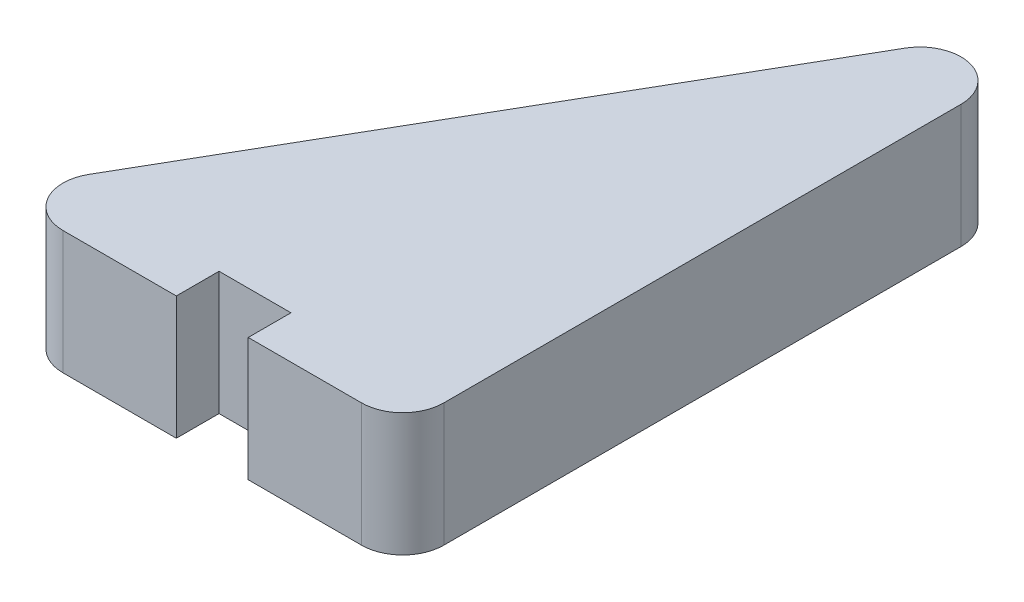
ISO-10303-21;
HEADER;
FILE_DESCRIPTION(('STEP AP214'),'2;1');
FILE_NAME('part.step','',(''),(''),'','','');
FILE_SCHEMA(('AUTOMOTIVE_DESIGN { 1 0 10303 214 1 1 1 1 }'));
ENDSEC;
DATA;
#1=APPLICATION_CONTEXT('core data for automotive mechanical design processes');
#2=APPLICATION_PROTOCOL_DEFINITION('international standard','automotive_design',2000,#1);
#3=PRODUCT_CONTEXT('',#1,'mechanical');
#4=PRODUCT('Part','Part','',(#3));
#5=PRODUCT_RELATED_PRODUCT_CATEGORY('part','',(#4));
#6=PRODUCT_DEFINITION_FORMATION('','',#4);
#7=PRODUCT_DEFINITION_CONTEXT('part definition',#1,'design');
#8=PRODUCT_DEFINITION('design','',#6,#7);
#9=PRODUCT_DEFINITION_SHAPE('','',#8);
#10=(LENGTH_UNIT() NAMED_UNIT(*) SI_UNIT(.MILLI.,.METRE.));
#11=(NAMED_UNIT(*) PLANE_ANGLE_UNIT() SI_UNIT($,.RADIAN.));
#12=(NAMED_UNIT(*) SI_UNIT($,.STERADIAN.) SOLID_ANGLE_UNIT());
#13=UNCERTAINTY_MEASURE_WITH_UNIT(LENGTH_MEASURE(1.E-05),#10,'distance_accuracy_value','');
#14=(GEOMETRIC_REPRESENTATION_CONTEXT(3) GLOBAL_UNCERTAINTY_ASSIGNED_CONTEXT((#13)) GLOBAL_UNIT_ASSIGNED_CONTEXT((#10,
#11,#12)) REPRESENTATION_CONTEXT('',''));
#15=CARTESIAN_POINT('',(0.,0.,0.));
#16=DIRECTION('',(0.,0.,1.));
#17=DIRECTION('',(1.,0.,0.));
#18=AXIS2_PLACEMENT_3D('',#15,#16,#17);
#19=CARTESIAN_POINT('',(-52.5014773719376,19.05,0.));
#20=DIRECTION('',(0.,0.,-1.));
#21=DIRECTION('',(-1.,0.,0.));
#22=AXIS2_PLACEMENT_3D('',#19,#20,#21);
#23=PLANE('',#22);
#24=DIRECTION('',(1.,0.,0.));
#25=VECTOR('',#24,1.);
#26=CARTESIAN_POINT('',(-52.5014773719376,0.,0.));
#27=LINE('',#26,#25);
#28=CARTESIAN_POINT('',(-52.5014773719376,0.,0.));
#29=VERTEX_POINT('',#28);
#30=CARTESIAN_POINT('',(-34.9819886859688,0.,0.));
#31=VERTEX_POINT('',#30);
#32=EDGE_CURVE('E136',#29,#31,#27,.T.);
#33=ORIENTED_EDGE('',*,*,#32,.T.);
#34=DIRECTION('',(0.,1.,0.));
#35=VECTOR('',#34,1.);
#36=CARTESIAN_POINT('',(-34.9819886859688,0.,0.));
#37=LINE('',#36,#35);
#38=CARTESIAN_POINT('',(-34.9819886859688,19.05,0.));
#39=VERTEX_POINT('',#38);
#40=EDGE_CURVE('E169',#31,#39,#37,.T.);
#41=ORIENTED_EDGE('',*,*,#40,.T.);
#42=DIRECTION('',(1.,0.,0.));
#43=VECTOR('',#42,1.);
#44=CARTESIAN_POINT('',(-52.5014773719376,19.05,0.));
#45=LINE('',#44,#43);
#46=CARTESIAN_POINT('',(-52.5014773719376,19.05,0.));
#47=VERTEX_POINT('',#46);
#48=EDGE_CURVE('E91',#47,#39,#45,.T.);
#49=ORIENTED_EDGE('',*,*,#48,.F.);
#50=DIRECTION('',(0.,-1.,0.));
#51=VECTOR('',#50,1.);
#52=CARTESIAN_POINT('',(-52.5014773719376,19.05,0.));
#53=LINE('',#52,#51);
#54=EDGE_CURVE('E11',#47,#29,#53,.T.);
#55=ORIENTED_EDGE('',*,*,#54,.T.);
#56=EDGE_LOOP('',(#33,#41,#49,#55));
#57=FACE_BOUND('',#56,.T.);
#58=ADVANCED_FACE('F32',(#57),#23,.F.);
#59=CARTESIAN_POINT('',(-52.5014773719376,19.05,-6.34999999999999));
#60=DIRECTION('',(0.,-1.,0.));
#61=DIRECTION('',(0.,0.,-1.));
#62=AXIS2_PLACEMENT_3D('',#59,#60,#61);
#63=CYLINDRICAL_SURFACE('',#62,6.35);
#64=CARTESIAN_POINT('',(-52.5014773719376,0.,-6.34999999999999));
#65=DIRECTION('',(0.,1.,0.));
#66=DIRECTION('',(0.,0.,1.));
#67=AXIS2_PLACEMENT_3D('',#64,#65,#66);
#68=CIRCLE('',#67,6.35);
#69=CARTESIAN_POINT('',(-58.0007386859687,0.,-9.52500000000002));
#70=VERTEX_POINT('',#69);
#71=EDGE_CURVE('E131',#70,#29,#68,.T.);
#72=ORIENTED_EDGE('',*,*,#71,.T.);
#73=ORIENTED_EDGE('',*,*,#54,.F.);
#74=CARTESIAN_POINT('',(-52.5014773719376,19.05,-6.34999999999999));
#75=DIRECTION('',(0.,1.,0.));
#76=DIRECTION('',(0.,0.,1.));
#77=AXIS2_PLACEMENT_3D('',#74,#75,#76);
#78=CIRCLE('',#77,6.35);
#79=CARTESIAN_POINT('',(-58.0007386859687,19.05,-9.52500000000002));
#80=VERTEX_POINT('',#79);
#81=EDGE_CURVE('E145',#80,#47,#78,.T.);
#82=ORIENTED_EDGE('',*,*,#81,.F.);
#83=DIRECTION('',(0.,-1.,0.));
#84=VECTOR('',#83,1.);
#85=CARTESIAN_POINT('',(-58.0007386859687,19.05,-9.52500000000002));
#86=LINE('',#85,#84);
#87=EDGE_CURVE('E127',#80,#70,#86,.T.);
#88=ORIENTED_EDGE('',*,*,#87,.T.);
#89=EDGE_LOOP('',(#72,#73,#82,#88));
#90=FACE_BOUND('',#89,.T.);
#91=ADVANCED_FACE('F34',(#90),#63,.T.);
#92=CARTESIAN_POINT('',(-23.8694886859688,19.05,0.));
#93=VERTEX_POINT('',#92);
#94=CARTESIAN_POINT('',(-6.35000000000004,19.05,0.));
#95=VERTEX_POINT('',#94);
#96=EDGE_CURVE('E165',#93,#95,#45,.T.);
#97=ORIENTED_EDGE('',*,*,#96,.F.);
#98=DIRECTION('',(0.,1.,0.));
#99=VECTOR('',#98,1.);
#100=CARTESIAN_POINT('',(-23.8694886859688,0.,0.));
#101=LINE('',#100,#99);
#102=CARTESIAN_POINT('',(-23.8694886859688,0.,0.));
#103=VERTEX_POINT('',#102);
#104=EDGE_CURVE('E203',#103,#93,#101,.T.);
#105=ORIENTED_EDGE('',*,*,#104,.F.);
#106=CARTESIAN_POINT('',(-6.35000000000004,0.,0.));
#107=VERTEX_POINT('',#106);
#108=EDGE_CURVE('E134',#103,#107,#27,.T.);
#109=ORIENTED_EDGE('',*,*,#108,.T.);
#110=DIRECTION('',(0.,-1.,0.));
#111=VECTOR('',#110,1.);
#112=CARTESIAN_POINT('',(-6.35000000000004,19.05,0.));
#113=LINE('',#112,#111);
#114=EDGE_CURVE('E40',#95,#107,#113,.T.);
#115=ORIENTED_EDGE('',*,*,#114,.F.);
#116=EDGE_LOOP('',(#97,#105,#109,#115));
#117=FACE_BOUND('',#116,.T.);
#118=ADVANCED_FACE('F212',(#117),#23,.F.);
#119=CARTESIAN_POINT('',(-6.35,19.05,-6.35));
#120=DIRECTION('',(0.,-1.,0.));
#121=DIRECTION('',(0.,0.,-1.));
#122=AXIS2_PLACEMENT_3D('',#119,#120,#121);
#123=CYLINDRICAL_SURFACE('',#122,6.35);
#124=CARTESIAN_POINT('',(-6.35,0.,-6.35));
#125=DIRECTION('',(0.,1.,0.));
#126=DIRECTION('',(0.,0.,-1.));
#127=AXIS2_PLACEMENT_3D('',#124,#125,#126);
#128=CIRCLE('',#127,6.35);
#129=CARTESIAN_POINT('',(0.,0.,-6.35000000000004));
#130=VERTEX_POINT('',#129);
#131=EDGE_CURVE('E139',#107,#130,#128,.T.);
#132=ORIENTED_EDGE('',*,*,#131,.T.);
#133=DIRECTION('',(0.,-1.,0.));
#134=VECTOR('',#133,1.);
#135=CARTESIAN_POINT('',(0.,19.05,-6.35000000000004));
#136=LINE('',#135,#134);
#137=CARTESIAN_POINT('',(0.,19.05,-6.35000000000004));
#138=VERTEX_POINT('',#137);
#139=EDGE_CURVE('E122',#138,#130,#136,.T.);
#140=ORIENTED_EDGE('',*,*,#139,.F.);
#141=CARTESIAN_POINT('',(-6.35,19.05,-6.35));
#142=DIRECTION('',(0.,1.,0.));
#143=DIRECTION('',(0.,0.,-1.));
#144=AXIS2_PLACEMENT_3D('',#141,#142,#143);
#145=CIRCLE('',#144,6.35);
#146=EDGE_CURVE('E110',#95,#138,#145,.T.);
#147=ORIENTED_EDGE('',*,*,#146,.F.);
#148=ORIENTED_EDGE('',*,*,#114,.T.);
#149=EDGE_LOOP('',(#132,#140,#147,#148));
#150=FACE_BOUND('',#149,.T.);
#151=ADVANCED_FACE('F152',(#150),#123,.T.);
#152=CARTESIAN_POINT('',(0.,19.05,-6.35000000000004));
#153=DIRECTION('',(-1.,0.,0.));
#154=DIRECTION('',(0.,0.,1.));
#155=AXIS2_PLACEMENT_3D('',#152,#153,#154);
#156=PLANE('',#155);
#157=DIRECTION('',(0.,0.,-1.));
#158=VECTOR('',#157,1.);
#159=CARTESIAN_POINT('',(0.,0.,-6.35000000000004));
#160=LINE('',#159,#158);
#161=CARTESIAN_POINT('',(0.,0.,-86.2867036525604));
#162=VERTEX_POINT('',#161);
#163=EDGE_CURVE('E119',#130,#162,#160,.T.);
#164=ORIENTED_EDGE('',*,*,#163,.T.);
#165=DIRECTION('',(0.,-1.,0.));
#166=VECTOR('',#165,1.);
#167=CARTESIAN_POINT('',(0.,19.05,-86.2867036525604));
#168=LINE('',#167,#166);
#169=CARTESIAN_POINT('',(0.,19.05,-86.2867036525604));
#170=VERTEX_POINT('',#169);
#171=EDGE_CURVE('E116',#170,#162,#168,.T.);
#172=ORIENTED_EDGE('',*,*,#171,.F.);
#173=DIRECTION('',(0.,0.,-1.));
#174=VECTOR('',#173,1.);
#175=CARTESIAN_POINT('',(0.,19.05,-6.35000000000004));
#176=LINE('',#175,#174);
#177=EDGE_CURVE('E102',#138,#170,#176,.T.);
#178=ORIENTED_EDGE('',*,*,#177,.F.);
#179=ORIENTED_EDGE('',*,*,#139,.T.);
#180=EDGE_LOOP('',(#164,#172,#178,#179));
#181=FACE_BOUND('',#180,.T.);
#182=ADVANCED_FACE('F117',(#181),#156,.F.);
#183=CARTESIAN_POINT('',(-6.35,19.05,-86.2867036525604));
#184=DIRECTION('',(0.,-1.,0.));
#185=DIRECTION('',(0.,0.,-1.));
#186=AXIS2_PLACEMENT_3D('',#183,#184,#185);
#187=CYLINDRICAL_SURFACE('',#186,6.35);
#188=CARTESIAN_POINT('',(-6.35,0.,-86.2867036525604));
#189=DIRECTION('',(0.,1.,0.));
#190=DIRECTION('',(0.,0.,1.));
#191=AXIS2_PLACEMENT_3D('',#188,#189,#190);
#192=CIRCLE('',#191,6.35);
#193=CARTESIAN_POINT('',(-11.8492613140312,0.,-89.4617036525604));
#194=VERTEX_POINT('',#193);
#195=EDGE_CURVE('E142',#162,#194,#192,.T.);
#196=ORIENTED_EDGE('',*,*,#195,.T.);
#197=DIRECTION('',(0.,-1.,0.));
#198=VECTOR('',#197,1.);
#199=CARTESIAN_POINT('',(-11.8492613140312,19.05,-89.4617036525604));
#200=LINE('',#199,#198);
#201=CARTESIAN_POINT('',(-11.8492613140312,19.05,-89.4617036525604));
#202=VERTEX_POINT('',#201);
#203=EDGE_CURVE('E123',#202,#194,#200,.T.);
#204=ORIENTED_EDGE('',*,*,#203,.F.);
#205=CARTESIAN_POINT('',(-6.35,19.05,-86.2867036525604));
#206=DIRECTION('',(0.,1.,0.));
#207=DIRECTION('',(0.,0.,1.));
#208=AXIS2_PLACEMENT_3D('',#205,#206,#207);
#209=CIRCLE('',#208,6.35);
#210=EDGE_CURVE('E107',#170,#202,#209,.T.);
#211=ORIENTED_EDGE('',*,*,#210,.F.);
#212=ORIENTED_EDGE('',*,*,#171,.T.);
#213=EDGE_LOOP('',(#196,#204,#211,#212));
#214=FACE_BOUND('',#213,.T.);
#215=ADVANCED_FACE('F125',(#214),#187,.T.);
#216=CARTESIAN_POINT('',(-11.8492613140312,19.05,-89.4617036525604));
#217=DIRECTION('',(0.866025403784436,0.,0.500000000000004));
#218=DIRECTION('',(0.500000000000004,0.,-0.866025403784436));
#219=AXIS2_PLACEMENT_3D('',#216,#217,#218);
#220=PLANE('',#219);
#221=DIRECTION('',(-0.500000000000004,0.,0.866025403784436));
#222=VECTOR('',#221,1.);
#223=CARTESIAN_POINT('',(-11.8492613140312,0.,-89.4617036525604));
#224=LINE('',#223,#222);
#225=EDGE_CURVE('E83',#194,#70,#224,.T.);
#226=ORIENTED_EDGE('',*,*,#225,.T.);
#227=ORIENTED_EDGE('',*,*,#87,.F.);
#228=DIRECTION('',(-0.500000000000004,0.,0.866025403784436));
#229=VECTOR('',#228,1.);
#230=CARTESIAN_POINT('',(-11.8492613140312,19.05,-89.4617036525604));
#231=LINE('',#230,#229);
#232=EDGE_CURVE('E56',#202,#80,#231,.T.);
#233=ORIENTED_EDGE('',*,*,#232,.F.);
#234=ORIENTED_EDGE('',*,*,#203,.T.);
#235=EDGE_LOOP('',(#226,#227,#233,#234));
#236=FACE_BOUND('',#235,.T.);
#237=ADVANCED_FACE('F161',(#236),#220,.F.);
#238=CARTESIAN_POINT('',(-52.5014773719376,19.05,-6.34999999999999));
#239=DIRECTION('',(0.,1.,0.));
#240=DIRECTION('',(0.,0.,1.));
#241=AXIS2_PLACEMENT_3D('',#238,#239,#240);
#242=PLANE('',#241);
#243=DIRECTION('',(0.,0.,1.));
#244=VECTOR('',#243,1.);
#245=CARTESIAN_POINT('',(-34.9819886859688,19.05,0.));
#246=LINE('',#245,#244);
#247=CARTESIAN_POINT('',(-34.9819886859688,19.05,-6.604));
#248=VERTEX_POINT('',#247);
#249=EDGE_CURVE('E174',#248,#39,#246,.T.);
#250=ORIENTED_EDGE('',*,*,#249,.F.);
#251=DIRECTION('',(-1.,0.,0.));
#252=VECTOR('',#251,1.);
#253=CARTESIAN_POINT('',(-34.9819886859688,19.05,-6.604));
#254=LINE('',#253,#252);
#255=CARTESIAN_POINT('',(-23.8694886859688,19.05,-6.604));
#256=VERTEX_POINT('',#255);
#257=EDGE_CURVE('E197',#256,#248,#254,.T.);
#258=ORIENTED_EDGE('',*,*,#257,.F.);
#259=DIRECTION('',(0.,0.,-1.));
#260=VECTOR('',#259,1.);
#261=CARTESIAN_POINT('',(-23.8694886859688,19.05,0.));
#262=LINE('',#261,#260);
#263=EDGE_CURVE('E207',#93,#256,#262,.T.);
#264=ORIENTED_EDGE('',*,*,#263,.F.);
#265=ORIENTED_EDGE('',*,*,#96,.T.);
#266=ORIENTED_EDGE('',*,*,#146,.T.);
#267=ORIENTED_EDGE('',*,*,#177,.T.);
#268=ORIENTED_EDGE('',*,*,#210,.T.);
#269=ORIENTED_EDGE('',*,*,#232,.T.);
#270=ORIENTED_EDGE('',*,*,#81,.T.);
#271=ORIENTED_EDGE('',*,*,#48,.T.);
#272=EDGE_LOOP('',(#250,#258,#264,#265,#266,#267,#268,#269,#270,#271));
#273=FACE_BOUND('',#272,.T.);
#274=ADVANCED_FACE('F105',(#273),#242,.T.);
#275=CARTESIAN_POINT('',(-52.5014773719376,0.,-6.34999999999999));
#276=DIRECTION('',(0.,1.,0.));
#277=DIRECTION('',(0.,0.,1.));
#278=AXIS2_PLACEMENT_3D('',#275,#276,#277);
#279=PLANE('',#278);
#280=DIRECTION('',(-1.,0.,0.));
#281=VECTOR('',#280,1.);
#282=CARTESIAN_POINT('',(-34.9819886859688,0.,-6.604));
#283=LINE('',#282,#281);
#284=CARTESIAN_POINT('',(-23.8694886859688,0.,-6.604));
#285=VERTEX_POINT('',#284);
#286=CARTESIAN_POINT('',(-34.9819886859688,0.,-6.604));
#287=VERTEX_POINT('',#286);
#288=EDGE_CURVE('E47',#285,#287,#283,.T.);
#289=ORIENTED_EDGE('',*,*,#288,.T.);
#290=DIRECTION('',(0.,0.,1.));
#291=VECTOR('',#290,1.);
#292=CARTESIAN_POINT('',(-34.9819886859688,0.,0.));
#293=LINE('',#292,#291);
#294=EDGE_CURVE('E199',#287,#31,#293,.T.);
#295=ORIENTED_EDGE('',*,*,#294,.T.);
#296=ORIENTED_EDGE('',*,*,#32,.F.);
#297=ORIENTED_EDGE('',*,*,#71,.F.);
#298=ORIENTED_EDGE('',*,*,#225,.F.);
#299=ORIENTED_EDGE('',*,*,#195,.F.);
#300=ORIENTED_EDGE('',*,*,#163,.F.);
#301=ORIENTED_EDGE('',*,*,#131,.F.);
#302=ORIENTED_EDGE('',*,*,#108,.F.);
#303=DIRECTION('',(0.,0.,-1.));
#304=VECTOR('',#303,1.);
#305=CARTESIAN_POINT('',(-23.8694886859688,0.,0.));
#306=LINE('',#305,#304);
#307=EDGE_CURVE('E194',#103,#285,#306,.T.);
#308=ORIENTED_EDGE('',*,*,#307,.T.);
#309=EDGE_LOOP('',(#289,#295,#296,#297,#298,#299,#300,#301,#302,#308));
#310=FACE_BOUND('',#309,.T.);
#311=ADVANCED_FACE('F157',(#310),#279,.F.);
#312=CARTESIAN_POINT('',(-34.9819886859688,0.,0.));
#313=DIRECTION('',(-1.,0.,0.));
#314=DIRECTION('',(0.,0.,1.));
#315=AXIS2_PLACEMENT_3D('',#312,#313,#314);
#316=PLANE('',#315);
#317=ORIENTED_EDGE('',*,*,#249,.T.);
#318=ORIENTED_EDGE('',*,*,#40,.F.);
#319=ORIENTED_EDGE('',*,*,#294,.F.);
#320=DIRECTION('',(0.,1.,0.));
#321=VECTOR('',#320,1.);
#322=CARTESIAN_POINT('',(-34.9819886859688,0.,-6.604));
#323=LINE('',#322,#321);
#324=EDGE_CURVE('E135',#287,#248,#323,.T.);
#325=ORIENTED_EDGE('',*,*,#324,.T.);
#326=EDGE_LOOP('',(#317,#318,#319,#325));
#327=FACE_BOUND('',#326,.T.);
#328=ADVANCED_FACE('F200',(#327),#316,.F.);
#329=CARTESIAN_POINT('',(-34.9819886859688,0.,-6.604));
#330=DIRECTION('',(0.,0.,-1.));
#331=DIRECTION('',(-1.,0.,0.));
#332=AXIS2_PLACEMENT_3D('',#329,#330,#331);
#333=PLANE('',#332);
#334=ORIENTED_EDGE('',*,*,#257,.T.);
#335=ORIENTED_EDGE('',*,*,#324,.F.);
#336=ORIENTED_EDGE('',*,*,#288,.F.);
#337=DIRECTION('',(0.,1.,0.));
#338=VECTOR('',#337,1.);
#339=CARTESIAN_POINT('',(-23.8694886859688,0.,-6.604));
#340=LINE('',#339,#338);
#341=EDGE_CURVE('E186',#285,#256,#340,.T.);
#342=ORIENTED_EDGE('',*,*,#341,.T.);
#343=EDGE_LOOP('',(#334,#335,#336,#342));
#344=FACE_BOUND('',#343,.T.);
#345=ADVANCED_FACE('F196',(#344),#333,.F.);
#346=CARTESIAN_POINT('',(-23.8694886859688,0.,0.));
#347=DIRECTION('',(1.,0.,0.));
#348=DIRECTION('',(0.,0.,-1.));
#349=AXIS2_PLACEMENT_3D('',#346,#347,#348);
#350=PLANE('',#349);
#351=ORIENTED_EDGE('',*,*,#263,.T.);
#352=ORIENTED_EDGE('',*,*,#341,.F.);
#353=ORIENTED_EDGE('',*,*,#307,.F.);
#354=ORIENTED_EDGE('',*,*,#104,.T.);
#355=EDGE_LOOP('',(#351,#352,#353,#354));
#356=FACE_BOUND('',#355,.T.);
#357=ADVANCED_FACE('F211',(#356),#350,.F.);
#358=CLOSED_SHELL('',(#58,#91,#118,#151,#182,#215,#237,#274,#311,#328,#345,#357));
#359=MANIFOLD_SOLID_BREP('B2',#358);
#360=ADVANCED_BREP_SHAPE_REPRESENTATION('',(#18,#359),#14);
#361=SHAPE_DEFINITION_REPRESENTATION(#9,#360);
ENDSEC;
END-ISO-10303-21;
